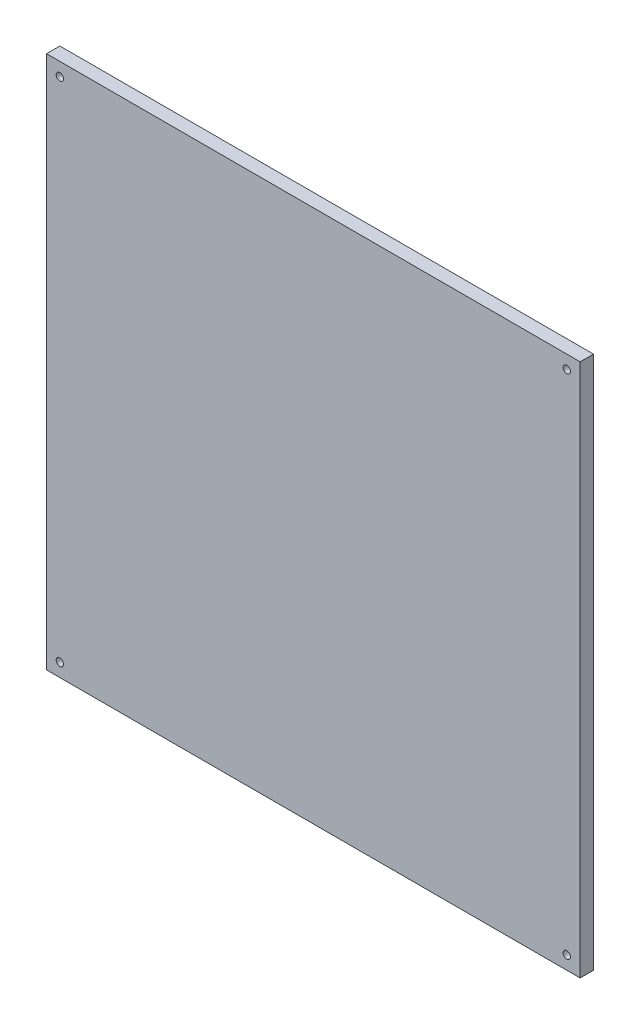
ISO-10303-21;
HEADER;
FILE_DESCRIPTION(('STEP AP214'),'2;1');
FILE_NAME('part.step','',(''),(''),'','','');
FILE_SCHEMA(('AUTOMOTIVE_DESIGN { 1 0 10303 214 1 1 1 1 }'));
ENDSEC;
DATA;
#1=APPLICATION_CONTEXT('core data for automotive mechanical design processes');
#2=APPLICATION_PROTOCOL_DEFINITION('international standard','automotive_design',2000,#1);
#3=PRODUCT_CONTEXT('',#1,'mechanical');
#4=PRODUCT('Part','Part','',(#3));
#5=PRODUCT_RELATED_PRODUCT_CATEGORY('part','',(#4));
#6=PRODUCT_DEFINITION_FORMATION('','',#4);
#7=PRODUCT_DEFINITION_CONTEXT('part definition',#1,'design');
#8=PRODUCT_DEFINITION('design','',#6,#7);
#9=PRODUCT_DEFINITION_SHAPE('','',#8);
#10=(LENGTH_UNIT() NAMED_UNIT(*) SI_UNIT(.MILLI.,.METRE.));
#11=(NAMED_UNIT(*) PLANE_ANGLE_UNIT() SI_UNIT($,.RADIAN.));
#12=(NAMED_UNIT(*) SI_UNIT($,.STERADIAN.) SOLID_ANGLE_UNIT());
#13=UNCERTAINTY_MEASURE_WITH_UNIT(LENGTH_MEASURE(1.E-05),#10,'distance_accuracy_value','');
#14=(GEOMETRIC_REPRESENTATION_CONTEXT(3) GLOBAL_UNCERTAINTY_ASSIGNED_CONTEXT((#13)) GLOBAL_UNIT_ASSIGNED_CONTEXT((#10,
#11,#12)) REPRESENTATION_CONTEXT('',''));
#15=CARTESIAN_POINT('',(0.,0.,0.));
#16=DIRECTION('',(0.,0.,1.));
#17=DIRECTION('',(1.,0.,0.));
#18=AXIS2_PLACEMENT_3D('',#15,#16,#17);
#19=CARTESIAN_POINT('',(200.,200.,10.));
#20=DIRECTION('',(0.,-1.,0.));
#21=DIRECTION('',(0.,0.,-1.));
#22=AXIS2_PLACEMENT_3D('',#19,#20,#21);
#23=PLANE('',#22);
#24=DIRECTION('',(-1.,0.,0.));
#25=VECTOR('',#24,1.);
#26=CARTESIAN_POINT('',(200.,200.,0.));
#27=LINE('',#26,#25);
#28=CARTESIAN_POINT('',(200.,200.,0.));
#29=VERTEX_POINT('',#28);
#30=CARTESIAN_POINT('',(-200.,200.,0.));
#31=VERTEX_POINT('',#30);
#32=EDGE_CURVE('E112',#29,#31,#27,.T.);
#33=ORIENTED_EDGE('',*,*,#32,.T.);
#34=DIRECTION('',(0.,0.,-1.));
#35=VECTOR('',#34,1.);
#36=CARTESIAN_POINT('',(-200.,200.,10.));
#37=LINE('',#36,#35);
#38=CARTESIAN_POINT('',(-200.,200.,10.));
#39=VERTEX_POINT('',#38);
#40=EDGE_CURVE('E13',#39,#31,#37,.T.);
#41=ORIENTED_EDGE('',*,*,#40,.F.);
#42=DIRECTION('',(-1.,0.,0.));
#43=VECTOR('',#42,1.);
#44=CARTESIAN_POINT('',(200.,200.,10.));
#45=LINE('',#44,#43);
#46=CARTESIAN_POINT('',(200.,200.,10.));
#47=VERTEX_POINT('',#46);
#48=EDGE_CURVE('E99',#47,#39,#45,.T.);
#49=ORIENTED_EDGE('',*,*,#48,.F.);
#50=DIRECTION('',(0.,0.,-1.));
#51=VECTOR('',#50,1.);
#52=CARTESIAN_POINT('',(200.,200.,10.));
#53=LINE('',#52,#51);
#54=EDGE_CURVE('E108',#47,#29,#53,.T.);
#55=ORIENTED_EDGE('',*,*,#54,.T.);
#56=EDGE_LOOP('',(#33,#41,#49,#55));
#57=FACE_BOUND('',#56,.T.);
#58=ADVANCED_FACE('F46',(#57),#23,.F.);
#59=CARTESIAN_POINT('',(-200.,200.,10.));
#60=DIRECTION('',(1.,0.,0.));
#61=DIRECTION('',(0.,1.,0.));
#62=AXIS2_PLACEMENT_3D('',#59,#60,#61);
#63=PLANE('',#62);
#64=DIRECTION('',(0.,-1.,0.));
#65=VECTOR('',#64,1.);
#66=CARTESIAN_POINT('',(-200.,200.,0.));
#67=LINE('',#66,#65);
#68=CARTESIAN_POINT('',(-200.,-200.,0.));
#69=VERTEX_POINT('',#68);
#70=EDGE_CURVE('E103',#31,#69,#67,.T.);
#71=ORIENTED_EDGE('',*,*,#70,.T.);
#72=DIRECTION('',(0.,0.,-1.));
#73=VECTOR('',#72,1.);
#74=CARTESIAN_POINT('',(-200.,-200.,10.));
#75=LINE('',#74,#73);
#76=CARTESIAN_POINT('',(-200.,-200.,10.));
#77=VERTEX_POINT('',#76);
#78=EDGE_CURVE('E55',#77,#69,#75,.T.);
#79=ORIENTED_EDGE('',*,*,#78,.F.);
#80=DIRECTION('',(0.,-1.,0.));
#81=VECTOR('',#80,1.);
#82=CARTESIAN_POINT('',(-200.,200.,10.));
#83=LINE('',#82,#81);
#84=EDGE_CURVE('E94',#39,#77,#83,.T.);
#85=ORIENTED_EDGE('',*,*,#84,.F.);
#86=ORIENTED_EDGE('',*,*,#40,.T.);
#87=EDGE_LOOP('',(#71,#79,#85,#86));
#88=FACE_BOUND('',#87,.T.);
#89=ADVANCED_FACE('F102',(#88),#63,.F.);
#90=CARTESIAN_POINT('',(-200.,-200.,10.));
#91=DIRECTION('',(0.,1.,0.));
#92=DIRECTION('',(-1.,0.,0.));
#93=AXIS2_PLACEMENT_3D('',#90,#91,#92);
#94=PLANE('',#93);
#95=DIRECTION('',(1.,0.,0.));
#96=VECTOR('',#95,1.);
#97=CARTESIAN_POINT('',(-200.,-200.,0.));
#98=LINE('',#97,#96);
#99=CARTESIAN_POINT('',(200.,-200.,0.));
#100=VERTEX_POINT('',#99);
#101=EDGE_CURVE('E81',#69,#100,#98,.T.);
#102=ORIENTED_EDGE('',*,*,#101,.T.);
#103=DIRECTION('',(0.,0.,-1.));
#104=VECTOR('',#103,1.);
#105=CARTESIAN_POINT('',(200.,-200.,10.));
#106=LINE('',#105,#104);
#107=CARTESIAN_POINT('',(200.,-200.,10.));
#108=VERTEX_POINT('',#107);
#109=EDGE_CURVE('E104',#108,#100,#106,.T.);
#110=ORIENTED_EDGE('',*,*,#109,.F.);
#111=DIRECTION('',(1.,0.,0.));
#112=VECTOR('',#111,1.);
#113=CARTESIAN_POINT('',(-200.,-200.,10.));
#114=LINE('',#113,#112);
#115=EDGE_CURVE('E97',#77,#108,#114,.T.);
#116=ORIENTED_EDGE('',*,*,#115,.F.);
#117=ORIENTED_EDGE('',*,*,#78,.T.);
#118=EDGE_LOOP('',(#102,#110,#116,#117));
#119=FACE_BOUND('',#118,.T.);
#120=ADVANCED_FACE('F106',(#119),#94,.F.);
#121=CARTESIAN_POINT('',(200.,-200.,10.));
#122=DIRECTION('',(-1.,0.,0.));
#123=DIRECTION('',(0.,-1.,0.));
#124=AXIS2_PLACEMENT_3D('',#121,#122,#123);
#125=PLANE('',#124);
#126=DIRECTION('',(0.,1.,0.));
#127=VECTOR('',#126,1.);
#128=CARTESIAN_POINT('',(200.,-200.,0.));
#129=LINE('',#128,#127);
#130=EDGE_CURVE('E87',#100,#29,#129,.T.);
#131=ORIENTED_EDGE('',*,*,#130,.T.);
#132=ORIENTED_EDGE('',*,*,#54,.F.);
#133=DIRECTION('',(0.,1.,0.));
#134=VECTOR('',#133,1.);
#135=CARTESIAN_POINT('',(200.,-200.,10.));
#136=LINE('',#135,#134);
#137=EDGE_CURVE('E64',#108,#47,#136,.T.);
#138=ORIENTED_EDGE('',*,*,#137,.F.);
#139=ORIENTED_EDGE('',*,*,#109,.T.);
#140=EDGE_LOOP('',(#131,#132,#138,#139));
#141=FACE_BOUND('',#140,.T.);
#142=ADVANCED_FACE('F176',(#141),#125,.F.);
#143=CARTESIAN_POINT('',(0.,0.,10.));
#144=DIRECTION('',(0.,0.,1.));
#145=DIRECTION('',(1.,0.,0.));
#146=AXIS2_PLACEMENT_3D('',#143,#144,#145);
#147=PLANE('',#146);
#148=CARTESIAN_POINT('',(190.,190.,10.));
#149=DIRECTION('',(0.,0.,1.));
#150=DIRECTION('',(1.,0.,0.));
#151=AXIS2_PLACEMENT_3D('',#148,#149,#150);
#152=CIRCLE('',#151,2.75);
#153=CARTESIAN_POINT('',(192.75,190.,10.));
#154=VERTEX_POINT('',#153);
#155=EDGE_CURVE('E141',#154,#154,#152,.T.);
#156=ORIENTED_EDGE('',*,*,#155,.F.);
#157=EDGE_LOOP('',(#156));
#158=FACE_BOUND('',#157,.T.);
#159=CARTESIAN_POINT('',(-190.,190.,10.));
#160=DIRECTION('',(0.,0.,1.));
#161=DIRECTION('',(1.,0.,0.));
#162=AXIS2_PLACEMENT_3D('',#159,#160,#161);
#163=CIRCLE('',#162,2.75);
#164=CARTESIAN_POINT('',(-187.25,190.,10.));
#165=VERTEX_POINT('',#164);
#166=EDGE_CURVE('E138',#165,#165,#163,.T.);
#167=ORIENTED_EDGE('',*,*,#166,.F.);
#168=EDGE_LOOP('',(#167));
#169=FACE_BOUND('',#168,.T.);
#170=CARTESIAN_POINT('',(-190.,-190.,10.));
#171=DIRECTION('',(0.,0.,1.));
#172=DIRECTION('',(1.,0.,0.));
#173=AXIS2_PLACEMENT_3D('',#170,#171,#172);
#174=CIRCLE('',#173,2.75);
#175=CARTESIAN_POINT('',(-187.25,-190.,10.));
#176=VERTEX_POINT('',#175);
#177=EDGE_CURVE('E130',#176,#176,#174,.T.);
#178=ORIENTED_EDGE('',*,*,#177,.F.);
#179=EDGE_LOOP('',(#178));
#180=FACE_BOUND('',#179,.T.);
#181=CARTESIAN_POINT('',(190.,-190.,10.));
#182=DIRECTION('',(0.,0.,1.));
#183=DIRECTION('',(1.,0.,0.));
#184=AXIS2_PLACEMENT_3D('',#181,#182,#183);
#185=CIRCLE('',#184,2.75);
#186=CARTESIAN_POINT('',(192.75,-190.,10.));
#187=VERTEX_POINT('',#186);
#188=EDGE_CURVE('E121',#187,#187,#185,.T.);
#189=ORIENTED_EDGE('',*,*,#188,.F.);
#190=EDGE_LOOP('',(#189));
#191=FACE_BOUND('',#190,.T.);
#192=ORIENTED_EDGE('',*,*,#48,.T.);
#193=ORIENTED_EDGE('',*,*,#84,.T.);
#194=ORIENTED_EDGE('',*,*,#115,.T.);
#195=ORIENTED_EDGE('',*,*,#137,.T.);
#196=EDGE_LOOP('',(#192,#193,#194,#195));
#197=FACE_BOUND('',#196,.T.);
#198=ADVANCED_FACE('F95',(#158,#169,#180,#191,#197),#147,.T.);
#199=CARTESIAN_POINT('',(0.,0.,0.));
#200=DIRECTION('',(0.,0.,1.));
#201=DIRECTION('',(1.,0.,0.));
#202=AXIS2_PLACEMENT_3D('',#199,#200,#201);
#203=PLANE('',#202);
#204=CARTESIAN_POINT('',(190.,190.,0.));
#205=DIRECTION('',(0.,0.,1.));
#206=DIRECTION('',(1.,0.,0.));
#207=AXIS2_PLACEMENT_3D('',#204,#205,#206);
#208=CIRCLE('',#207,2.75);
#209=CARTESIAN_POINT('',(192.75,190.,0.));
#210=VERTEX_POINT('',#209);
#211=EDGE_CURVE('E49',#210,#210,#208,.T.);
#212=ORIENTED_EDGE('',*,*,#211,.T.);
#213=EDGE_LOOP('',(#212));
#214=FACE_BOUND('',#213,.T.);
#215=CARTESIAN_POINT('',(-190.,190.,0.));
#216=DIRECTION('',(0.,0.,1.));
#217=DIRECTION('',(1.,0.,0.));
#218=AXIS2_PLACEMENT_3D('',#215,#216,#217);
#219=CIRCLE('',#218,2.75);
#220=CARTESIAN_POINT('',(-187.25,190.,0.));
#221=VERTEX_POINT('',#220);
#222=EDGE_CURVE('E135',#221,#221,#219,.T.);
#223=ORIENTED_EDGE('',*,*,#222,.T.);
#224=EDGE_LOOP('',(#223));
#225=FACE_BOUND('',#224,.T.);
#226=CARTESIAN_POINT('',(-190.,-190.,0.));
#227=DIRECTION('',(0.,0.,1.));
#228=DIRECTION('',(1.,0.,0.));
#229=AXIS2_PLACEMENT_3D('',#226,#227,#228);
#230=CIRCLE('',#229,2.75);
#231=CARTESIAN_POINT('',(-187.25,-190.,0.));
#232=VERTEX_POINT('',#231);
#233=EDGE_CURVE('E125',#232,#232,#230,.T.);
#234=ORIENTED_EDGE('',*,*,#233,.T.);
#235=EDGE_LOOP('',(#234));
#236=FACE_BOUND('',#235,.T.);
#237=CARTESIAN_POINT('',(190.,-190.,0.));
#238=DIRECTION('',(0.,0.,1.));
#239=DIRECTION('',(1.,0.,0.));
#240=AXIS2_PLACEMENT_3D('',#237,#238,#239);
#241=CIRCLE('',#240,2.75);
#242=CARTESIAN_POINT('',(192.75,-190.,0.));
#243=VERTEX_POINT('',#242);
#244=EDGE_CURVE('E115',#243,#243,#241,.T.);
#245=ORIENTED_EDGE('',*,*,#244,.T.);
#246=EDGE_LOOP('',(#245));
#247=FACE_BOUND('',#246,.T.);
#248=ORIENTED_EDGE('',*,*,#32,.F.);
#249=ORIENTED_EDGE('',*,*,#130,.F.);
#250=ORIENTED_EDGE('',*,*,#101,.F.);
#251=ORIENTED_EDGE('',*,*,#70,.F.);
#252=EDGE_LOOP('',(#248,#249,#250,#251));
#253=FACE_BOUND('',#252,.T.);
#254=ADVANCED_FACE('F148',(#214,#225,#236,#247,#253),#203,.F.);
#255=CARTESIAN_POINT('',(190.,-190.,10.));
#256=DIRECTION('',(0.,0.,1.));
#257=DIRECTION('',(1.,0.,0.));
#258=AXIS2_PLACEMENT_3D('',#255,#256,#257);
#259=CYLINDRICAL_SURFACE('',#258,2.75);
#260=ORIENTED_EDGE('',*,*,#188,.T.);
#261=EDGE_LOOP('',(#260));
#262=FACE_BOUND('',#261,.T.);
#263=ORIENTED_EDGE('',*,*,#244,.F.);
#264=EDGE_LOOP('',(#263));
#265=FACE_BOUND('',#264,.T.);
#266=ADVANCED_FACE('F169',(#262,#265),#259,.F.);
#267=CARTESIAN_POINT('',(-190.,-190.,10.));
#268=DIRECTION('',(0.,0.,1.));
#269=DIRECTION('',(1.,0.,0.));
#270=AXIS2_PLACEMENT_3D('',#267,#268,#269);
#271=CYLINDRICAL_SURFACE('',#270,2.75);
#272=ORIENTED_EDGE('',*,*,#177,.T.);
#273=EDGE_LOOP('',(#272));
#274=FACE_BOUND('',#273,.T.);
#275=ORIENTED_EDGE('',*,*,#233,.F.);
#276=EDGE_LOOP('',(#275));
#277=FACE_BOUND('',#276,.T.);
#278=ADVANCED_FACE('F158',(#274,#277),#271,.F.);
#279=CARTESIAN_POINT('',(-190.,190.,10.));
#280=DIRECTION('',(0.,0.,1.));
#281=DIRECTION('',(1.,0.,0.));
#282=AXIS2_PLACEMENT_3D('',#279,#280,#281);
#283=CYLINDRICAL_SURFACE('',#282,2.75);
#284=ORIENTED_EDGE('',*,*,#166,.T.);
#285=EDGE_LOOP('',(#284));
#286=FACE_BOUND('',#285,.T.);
#287=ORIENTED_EDGE('',*,*,#222,.F.);
#288=EDGE_LOOP('',(#287));
#289=FACE_BOUND('',#288,.T.);
#290=ADVANCED_FACE('F153',(#286,#289),#283,.F.);
#291=CARTESIAN_POINT('',(190.,190.,10.));
#292=DIRECTION('',(0.,0.,1.));
#293=DIRECTION('',(1.,0.,0.));
#294=AXIS2_PLACEMENT_3D('',#291,#292,#293);
#295=CYLINDRICAL_SURFACE('',#294,2.75);
#296=ORIENTED_EDGE('',*,*,#155,.T.);
#297=EDGE_LOOP('',(#296));
#298=FACE_BOUND('',#297,.T.);
#299=ORIENTED_EDGE('',*,*,#211,.F.);
#300=EDGE_LOOP('',(#299));
#301=FACE_BOUND('',#300,.T.);
#302=ADVANCED_FACE('F151',(#298,#301),#295,.F.);
#303=CLOSED_SHELL('',(#58,#89,#120,#142,#198,#254,#266,#278,#290,#302));
#304=MANIFOLD_SOLID_BREP('B2',#303);
#305=ADVANCED_BREP_SHAPE_REPRESENTATION('',(#18,#304),#14);
#306=SHAPE_DEFINITION_REPRESENTATION(#9,#305);
ENDSEC;
END-ISO-10303-21;
